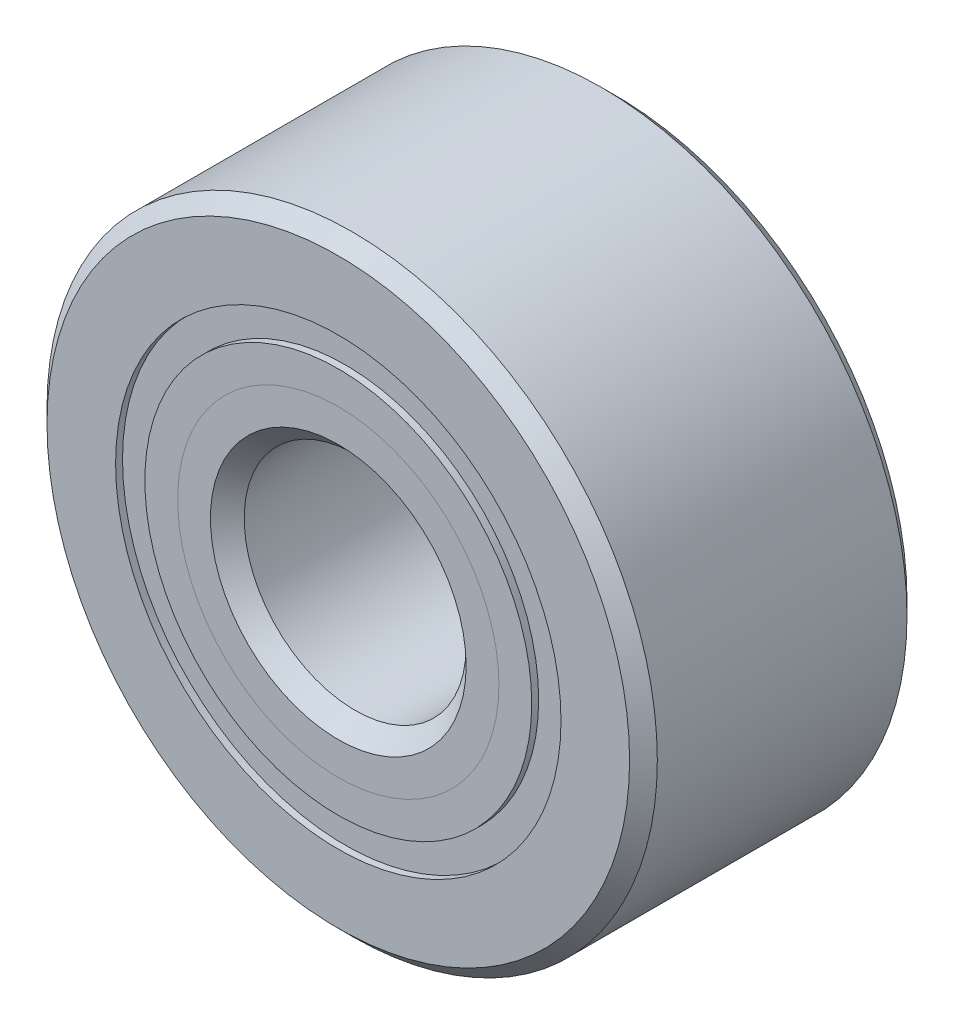
ISO-10303-21;
HEADER;
FILE_DESCRIPTION(('STEP AP214'),'2;1');
FILE_NAME('part.step','',(''),(''),'','','');
FILE_SCHEMA(('AUTOMOTIVE_DESIGN { 1 0 10303 214 1 1 1 1 }'));
ENDSEC;
DATA;
#1=APPLICATION_CONTEXT('core data for automotive mechanical design processes');
#2=APPLICATION_PROTOCOL_DEFINITION('international standard','automotive_design',2000,#1);
#3=PRODUCT_CONTEXT('',#1,'mechanical');
#4=PRODUCT('Part','Part','',(#3));
#5=PRODUCT_RELATED_PRODUCT_CATEGORY('part','',(#4));
#6=PRODUCT_DEFINITION_FORMATION('','',#4);
#7=PRODUCT_DEFINITION_CONTEXT('part definition',#1,'design');
#8=PRODUCT_DEFINITION('design','',#6,#7);
#9=PRODUCT_DEFINITION_SHAPE('','',#8);
#10=(LENGTH_UNIT() NAMED_UNIT(*) SI_UNIT(.MILLI.,.METRE.));
#11=(NAMED_UNIT(*) PLANE_ANGLE_UNIT() SI_UNIT($,.RADIAN.));
#12=(NAMED_UNIT(*) SI_UNIT($,.STERADIAN.) SOLID_ANGLE_UNIT());
#13=UNCERTAINTY_MEASURE_WITH_UNIT(LENGTH_MEASURE(1.E-05),#10,'distance_accuracy_value','');
#14=(GEOMETRIC_REPRESENTATION_CONTEXT(3) GLOBAL_UNCERTAINTY_ASSIGNED_CONTEXT((#13)) GLOBAL_UNIT_ASSIGNED_CONTEXT((#10,
#11,#12)) REPRESENTATION_CONTEXT('',''));
#15=CARTESIAN_POINT('',(0.,0.,0.));
#16=DIRECTION('',(0.,0.,1.));
#17=DIRECTION('',(1.,0.,0.));
#18=AXIS2_PLACEMENT_3D('',#15,#16,#17);
#19=CARTESIAN_POINT('',(0.,6.37180631868132,-3.7703125));
#20=DIRECTION('',(0.,0.,1.));
#21=DIRECTION('',(1.,0.,0.));
#22=AXIS2_PLACEMENT_3D('',#19,#20,#21);
#23=PLANE('',#22);
#24=CARTESIAN_POINT('',(0.,0.,-3.7703125));
#25=DIRECTION('',(0.,0.,1.));
#26=DIRECTION('',(1.,0.,0.));
#27=AXIS2_PLACEMENT_3D('',#24,#25,#26);
#28=CIRCLE('',#27,6.37180631868132);
#29=CARTESIAN_POINT('',(6.37180631868132,0.,-3.7703125));
#30=VERTEX_POINT('',#29);
#31=EDGE_CURVE('E56',#30,#30,#28,.T.);
#32=ORIENTED_EDGE('',*,*,#31,.F.);
#33=EDGE_LOOP('',(#32));
#34=FACE_BOUND('',#33,.T.);
#35=CARTESIAN_POINT('',(0.,0.,-3.7703125));
#36=DIRECTION('',(0.,0.,1.));
#37=DIRECTION('',(1.,0.,0.));
#38=AXIS2_PLACEMENT_3D('',#35,#36,#37);
#39=CIRCLE('',#38,5.53444368131868);
#40=CARTESIAN_POINT('',(5.53444368131868,0.,-3.7703125));
#41=VERTEX_POINT('',#40);
#42=EDGE_CURVE('E11',#41,#41,#39,.T.);
#43=ORIENTED_EDGE('',*,*,#42,.T.);
#44=EDGE_LOOP('',(#43));
#45=FACE_BOUND('',#44,.T.);
#46=ADVANCED_FACE('F42',(#34,#45),#23,.F.);
#47=CARTESIAN_POINT('',(0.,0.,3.96875));
#48=DIRECTION('',(0.,0.,1.));
#49=DIRECTION('',(1.,0.,0.));
#50=AXIS2_PLACEMENT_3D('',#47,#48,#49);
#51=CYLINDRICAL_SURFACE('',#50,5.53444368131868);
#52=ORIENTED_EDGE('',*,*,#42,.F.);
#53=EDGE_LOOP('',(#52));
#54=FACE_BOUND('',#53,.T.);
#55=CARTESIAN_POINT('',(0.,0.,-1.81289769677122));
#56=DIRECTION('',(0.,0.,1.));
#57=DIRECTION('',(1.,0.,0.));
#58=AXIS2_PLACEMENT_3D('',#55,#56,#57);
#59=CIRCLE('',#58,5.53444368131868);
#60=CARTESIAN_POINT('',(5.53444368131868,0.,-1.81289769677122));
#61=VERTEX_POINT('',#60);
#62=EDGE_CURVE('E48',#61,#61,#59,.T.);
#63=ORIENTED_EDGE('',*,*,#62,.T.);
#64=EDGE_LOOP('',(#63));
#65=FACE_BOUND('',#64,.T.);
#66=ADVANCED_FACE('F65',(#54,#65),#51,.F.);
#67=CARTESIAN_POINT('',(0.,6.37180631868131,-1.81289769677122));
#68=DIRECTION('',(0.,0.,-1.));
#69=DIRECTION('',(-1.,0.,0.));
#70=AXIS2_PLACEMENT_3D('',#67,#68,#69);
#71=PLANE('',#70);
#72=ORIENTED_EDGE('',*,*,#62,.F.);
#73=EDGE_LOOP('',(#72));
#74=FACE_BOUND('',#73,.T.);
#75=CARTESIAN_POINT('',(0.,0.,-1.81289769677122));
#76=DIRECTION('',(0.,0.,1.));
#77=DIRECTION('',(1.,0.,0.));
#78=AXIS2_PLACEMENT_3D('',#75,#76,#77);
#79=CIRCLE('',#78,6.37180631868131);
#80=CARTESIAN_POINT('',(6.37180631868131,0.,-1.81289769677122));
#81=VERTEX_POINT('',#80);
#82=EDGE_CURVE('E52',#81,#81,#79,.T.);
#83=ORIENTED_EDGE('',*,*,#82,.T.);
#84=EDGE_LOOP('',(#83));
#85=FACE_BOUND('',#84,.T.);
#86=ADVANCED_FACE('F69',(#74,#85),#71,.F.);
#87=CARTESIAN_POINT('',(0.,0.,3.96875));
#88=DIRECTION('',(0.,0.,1.));
#89=DIRECTION('',(1.,0.,0.));
#90=AXIS2_PLACEMENT_3D('',#87,#88,#89);
#91=CYLINDRICAL_SURFACE('',#90,6.37180631868132);
#92=ORIENTED_EDGE('',*,*,#82,.F.);
#93=EDGE_LOOP('',(#92));
#94=FACE_BOUND('',#93,.T.);
#95=ORIENTED_EDGE('',*,*,#31,.T.);
#96=EDGE_LOOP('',(#95));
#97=FACE_BOUND('',#96,.T.);
#98=ADVANCED_FACE('F62',(#94,#97),#91,.T.);
#99=CLOSED_SHELL('',(#46,#66,#86,#98));
#100=MANIFOLD_SOLID_BREP('B2',#99);
#101=CARTESIAN_POINT('',(0.,6.37180631868131,3.7703125));
#102=DIRECTION('',(0.,0.,-1.));
#103=DIRECTION('',(-1.,0.,0.));
#104=AXIS2_PLACEMENT_3D('',#101,#102,#103);
#105=PLANE('',#104);
#106=CARTESIAN_POINT('',(0.,0.,3.7703125));
#107=DIRECTION('',(0.,0.,1.));
#108=DIRECTION('',(1.,0.,0.));
#109=AXIS2_PLACEMENT_3D('',#106,#107,#108);
#110=CIRCLE('',#109,5.53444368131868);
#111=CARTESIAN_POINT('',(5.53444368131868,0.,3.7703125));
#112=VERTEX_POINT('',#111);
#113=EDGE_CURVE('E41',#112,#112,#110,.T.);
#114=ORIENTED_EDGE('',*,*,#113,.F.);
#115=EDGE_LOOP('',(#114));
#116=FACE_BOUND('',#115,.T.);
#117=CARTESIAN_POINT('',(0.,0.,3.7703125));
#118=DIRECTION('',(0.,0.,1.));
#119=DIRECTION('',(1.,0.,0.));
#120=AXIS2_PLACEMENT_3D('',#117,#118,#119);
#121=CIRCLE('',#120,6.37180631868131);
#122=CARTESIAN_POINT('',(6.37180631868131,0.,3.7703125));
#123=VERTEX_POINT('',#122);
#124=EDGE_CURVE('E124',#123,#123,#121,.T.);
#125=ORIENTED_EDGE('',*,*,#124,.T.);
#126=EDGE_LOOP('',(#125));
#127=FACE_BOUND('',#126,.T.);
#128=ADVANCED_FACE('F110',(#116,#127),#105,.F.);
#129=CARTESIAN_POINT('',(0.,0.,3.96875));
#130=DIRECTION('',(0.,0.,1.));
#131=DIRECTION('',(1.,0.,0.));
#132=AXIS2_PLACEMENT_3D('',#129,#130,#131);
#133=CYLINDRICAL_SURFACE('',#132,5.53444368131868);
#134=CARTESIAN_POINT('',(0.,0.,1.81289769677122));
#135=DIRECTION('',(0.,0.,1.));
#136=DIRECTION('',(1.,0.,0.));
#137=AXIS2_PLACEMENT_3D('',#134,#135,#136);
#138=CIRCLE('',#137,5.53444368131868);
#139=CARTESIAN_POINT('',(5.53444368131868,0.,1.81289769677122));
#140=VERTEX_POINT('',#139);
#141=EDGE_CURVE('E116',#140,#140,#138,.T.);
#142=ORIENTED_EDGE('',*,*,#141,.F.);
#143=EDGE_LOOP('',(#142));
#144=FACE_BOUND('',#143,.T.);
#145=ORIENTED_EDGE('',*,*,#113,.T.);
#146=EDGE_LOOP('',(#145));
#147=FACE_BOUND('',#146,.T.);
#148=ADVANCED_FACE('F139',(#144,#147),#133,.F.);
#149=CARTESIAN_POINT('',(0.,6.37180631868131,1.81289769677122));
#150=DIRECTION('',(0.,0.,1.));
#151=DIRECTION('',(1.,0.,0.));
#152=AXIS2_PLACEMENT_3D('',#149,#150,#151);
#153=PLANE('',#152);
#154=CARTESIAN_POINT('',(0.,0.,1.81289769677122));
#155=DIRECTION('',(0.,0.,1.));
#156=DIRECTION('',(1.,0.,0.));
#157=AXIS2_PLACEMENT_3D('',#154,#155,#156);
#158=CIRCLE('',#157,6.37180631868131);
#159=CARTESIAN_POINT('',(6.37180631868131,0.,1.81289769677122));
#160=VERTEX_POINT('',#159);
#161=EDGE_CURVE('E120',#160,#160,#158,.T.);
#162=ORIENTED_EDGE('',*,*,#161,.F.);
#163=EDGE_LOOP('',(#162));
#164=FACE_BOUND('',#163,.T.);
#165=ORIENTED_EDGE('',*,*,#141,.T.);
#166=EDGE_LOOP('',(#165));
#167=FACE_BOUND('',#166,.T.);
#168=ADVANCED_FACE('F134',(#164,#167),#153,.F.);
#169=CARTESIAN_POINT('',(0.,0.,3.96875));
#170=DIRECTION('',(0.,0.,1.));
#171=DIRECTION('',(1.,0.,0.));
#172=AXIS2_PLACEMENT_3D('',#169,#170,#171);
#173=CYLINDRICAL_SURFACE('',#172,6.37180631868131);
#174=ORIENTED_EDGE('',*,*,#124,.F.);
#175=EDGE_LOOP('',(#174));
#176=FACE_BOUND('',#175,.T.);
#177=ORIENTED_EDGE('',*,*,#161,.T.);
#178=EDGE_LOOP('',(#177));
#179=FACE_BOUND('',#178,.T.);
#180=ADVANCED_FACE('F131',(#176,#179),#173,.T.);
#181=CLOSED_SHELL('',(#128,#148,#168,#180));
#182=MANIFOLD_SOLID_BREP('B6',#181);
#183=CARTESIAN_POINT('',(-4.20949505675111,4.20949505675122,0.));
#184=DIRECTION('',(0.,0.,1.));
#185=DIRECTION('',(-0.707106781186539,0.707106781186556,0.));
#186=AXIS2_PLACEMENT_3D('',#183,#184,#185);
#187=SPHERICAL_SURFACE('',#186,1.81289769677122);
#188=CARTESIAN_POINT('',(-4.20949505675111,4.20949505675122,1.81289769677122));
#189=VERTEX_POINT('',#188);
#190=VERTEX_LOOP('',#189);
#191=FACE_BOUND('',#190,.T.);
#192=ADVANCED_FACE('F179',(#191),#187,.T.);
#193=CLOSED_SHELL('',(#192));
#194=MANIFOLD_SOLID_BREP('B36',#193);
#195=CARTESIAN_POINT('',(-5.953125,0.,0.));
#196=DIRECTION('',(0.,0.,1.));
#197=DIRECTION('',(-1.,0.,0.));
#198=AXIS2_PLACEMENT_3D('',#195,#196,#197);
#199=SPHERICAL_SURFACE('',#198,1.81289769677122);
#200=CARTESIAN_POINT('',(-5.953125,0.,1.81289769677122));
#201=VERTEX_POINT('',#200);
#202=VERTEX_LOOP('',#201);
#203=FACE_BOUND('',#202,.T.);
#204=ADVANCED_FACE('F200',(#203),#199,.T.);
#205=CLOSED_SHELL('',(#204));
#206=MANIFOLD_SOLID_BREP('B106',#205);
#207=CARTESIAN_POINT('',(-4.2094950567512,-4.20949505675113,0.));
#208=DIRECTION('',(0.,0.,1.));
#209=DIRECTION('',(-0.707106781186554,-0.707106781186541,0.));
#210=AXIS2_PLACEMENT_3D('',#207,#208,#209);
#211=SPHERICAL_SURFACE('',#210,1.81289769677122);
#212=CARTESIAN_POINT('',(-4.2094950567512,-4.20949505675113,1.81289769677122));
#213=VERTEX_POINT('',#212);
#214=VERTEX_LOOP('',#213);
#215=FACE_BOUND('',#214,.T.);
#216=ADVANCED_FACE('F221',(#215),#211,.T.);
#217=CLOSED_SHELL('',(#216));
#218=MANIFOLD_SOLID_BREP('B175',#217);
#219=CARTESIAN_POINT('',(0.,-5.953125,0.));
#220=DIRECTION('',(0.,0.,1.));
#221=DIRECTION('',(0.,-1.,0.));
#222=AXIS2_PLACEMENT_3D('',#219,#220,#221);
#223=SPHERICAL_SURFACE('',#222,1.81289769677122);
#224=CARTESIAN_POINT('',(0.,-5.953125,1.81289769677122));
#225=VERTEX_POINT('',#224);
#226=VERTEX_LOOP('',#225);
#227=FACE_BOUND('',#226,.T.);
#228=ADVANCED_FACE('F242',(#227),#223,.T.);
#229=CLOSED_SHELL('',(#228));
#230=MANIFOLD_SOLID_BREP('B196',#229);
#231=CARTESIAN_POINT('',(4.20949505675114,-4.20949505675119,0.));
#232=DIRECTION('',(0.,0.,1.));
#233=DIRECTION('',(0.707106781186544,-0.707106781186551,0.));
#234=AXIS2_PLACEMENT_3D('',#231,#232,#233);
#235=SPHERICAL_SURFACE('',#234,1.81289769677122);
#236=CARTESIAN_POINT('',(4.20949505675114,-4.20949505675119,1.81289769677122));
#237=VERTEX_POINT('',#236);
#238=VERTEX_LOOP('',#237);
#239=FACE_BOUND('',#238,.T.);
#240=ADVANCED_FACE('F263',(#239),#235,.T.);
#241=CLOSED_SHELL('',(#240));
#242=MANIFOLD_SOLID_BREP('B217',#241);
#243=CARTESIAN_POINT('',(5.953125,0.,0.));
#244=DIRECTION('',(0.,0.,1.));
#245=DIRECTION('',(1.,0.,0.));
#246=AXIS2_PLACEMENT_3D('',#243,#244,#245);
#247=SPHERICAL_SURFACE('',#246,1.81289769677122);
#248=CARTESIAN_POINT('',(5.953125,0.,1.81289769677122));
#249=VERTEX_POINT('',#248);
#250=VERTEX_LOOP('',#249);
#251=FACE_BOUND('',#250,.T.);
#252=ADVANCED_FACE('F284',(#251),#247,.T.);
#253=CLOSED_SHELL('',(#252));
#254=MANIFOLD_SOLID_BREP('B238',#253);
#255=CARTESIAN_POINT('',(4.20949505675117,4.20949505675116,0.));
#256=DIRECTION('',(0.,0.,1.));
#257=DIRECTION('',(0.707106781186549,0.707106781186546,0.));
#258=AXIS2_PLACEMENT_3D('',#255,#256,#257);
#259=SPHERICAL_SURFACE('',#258,1.81289769677122);
#260=CARTESIAN_POINT('',(4.20949505675117,4.20949505675116,1.81289769677122));
#261=VERTEX_POINT('',#260);
#262=VERTEX_LOOP('',#261);
#263=FACE_BOUND('',#262,.T.);
#264=ADVANCED_FACE('F305',(#263),#259,.T.);
#265=CLOSED_SHELL('',(#264));
#266=MANIFOLD_SOLID_BREP('B259',#265);
#267=CARTESIAN_POINT('',(0.,5.953125,0.));
#268=DIRECTION('',(0.,0.,1.));
#269=DIRECTION('',(0.,1.,0.));
#270=AXIS2_PLACEMENT_3D('',#267,#268,#269);
#271=SPHERICAL_SURFACE('',#270,1.81289769677122);
#272=CARTESIAN_POINT('',(0.,5.953125,1.81289769677122));
#273=VERTEX_POINT('',#272);
#274=VERTEX_LOOP('',#273);
#275=FACE_BOUND('',#274,.T.);
#276=ADVANCED_FACE('F327',(#275),#271,.T.);
#277=CLOSED_SHELL('',(#276));
#278=MANIFOLD_SOLID_BREP('B280',#277);
#279=CARTESIAN_POINT('',(0.,4.59602866646653,3.96875));
#280=DIRECTION('',(0.,0.,-1.));
#281=DIRECTION('',(-1.,0.,0.));
#282=AXIS2_PLACEMENT_3D('',#279,#280,#281);
#283=PLANE('',#282);
#284=CARTESIAN_POINT('',(0.,0.,3.96875));
#285=DIRECTION('',(0.,0.,1.));
#286=DIRECTION('',(1.,0.,0.));
#287=AXIS2_PLACEMENT_3D('',#284,#285,#286);
#288=CIRCLE('',#287,3.65761365161439);
#289=CARTESIAN_POINT('',(3.65761365161439,0.,3.96875));
#290=VERTEX_POINT('',#289);
#291=EDGE_CURVE('E382',#290,#290,#288,.T.);
#292=ORIENTED_EDGE('',*,*,#291,.F.);
#293=EDGE_LOOP('',(#292));
#294=FACE_BOUND('',#293,.T.);
#295=CARTESIAN_POINT('',(0.,0.,3.96875));
#296=DIRECTION('',(0.,0.,1.));
#297=DIRECTION('',(1.,0.,0.));
#298=AXIS2_PLACEMENT_3D('',#295,#296,#297);
#299=CIRCLE('',#298,4.59602866646653);
#300=CARTESIAN_POINT('',(4.59602866646653,0.,3.96875));
#301=VERTEX_POINT('',#300);
#302=EDGE_CURVE('E326',#301,#301,#299,.T.);
#303=ORIENTED_EDGE('',*,*,#302,.T.);
#304=EDGE_LOOP('',(#303));
#305=FACE_BOUND('',#304,.T.);
#306=ADVANCED_FACE('F348',(#294,#305),#283,.F.);
#307=CARTESIAN_POINT('',(0.,0.,3.03033498514786));
#308=DIRECTION('',(0.,0.,1.));
#309=DIRECTION('',(1.,0.,0.));
#310=AXIS2_PLACEMENT_3D('',#307,#308,#309);
#311=CONICAL_SURFACE('',#310,3.65761365161439,0.785398163397451);
#312=ORIENTED_EDGE('',*,*,#302,.F.);
#313=EDGE_LOOP('',(#312));
#314=FACE_BOUND('',#313,.T.);
#315=CARTESIAN_POINT('',(0.,0.,3.03033498514786));
#316=DIRECTION('',(0.,0.,1.));
#317=DIRECTION('',(1.,0.,0.));
#318=AXIS2_PLACEMENT_3D('',#315,#316,#317);
#319=CIRCLE('',#318,3.65761365161439);
#320=CARTESIAN_POINT('',(3.65761365161439,0.,3.03033498514786));
#321=VERTEX_POINT('',#320);
#322=EDGE_CURVE('E354',#321,#321,#319,.T.);
#323=ORIENTED_EDGE('',*,*,#322,.T.);
#324=EDGE_LOOP('',(#323));
#325=FACE_BOUND('',#324,.T.);
#326=ADVANCED_FACE('F389',(#314,#325),#311,.T.);
#327=CARTESIAN_POINT('',(0.,0.,3.96875));
#328=DIRECTION('',(0.,0.,1.));
#329=DIRECTION('',(1.,0.,0.));
#330=AXIS2_PLACEMENT_3D('',#327,#328,#329);
#331=CYLINDRICAL_SURFACE('',#330,3.65761365161439);
#332=ORIENTED_EDGE('',*,*,#322,.F.);
#333=EDGE_LOOP('',(#332));
#334=FACE_BOUND('',#333,.T.);
#335=CARTESIAN_POINT('',(0.,0.,0.));
#336=DIRECTION('',(0.,0.,1.));
#337=DIRECTION('',(1.,0.,0.));
#338=AXIS2_PLACEMENT_3D('',#335,#336,#337);
#339=CIRCLE('',#338,3.65761365161439);
#340=CARTESIAN_POINT('',(3.65761365161439,0.,0.));
#341=VERTEX_POINT('',#340);
#342=EDGE_CURVE('E358',#341,#341,#339,.T.);
#343=ORIENTED_EDGE('',*,*,#342,.T.);
#344=EDGE_LOOP('',(#343));
#345=FACE_BOUND('',#344,.T.);
#346=ADVANCED_FACE('F393',(#334,#345),#331,.T.);
#347=CARTESIAN_POINT('',(0.,3.65761365161439,0.));
#348=DIRECTION('',(0.,0.,-1.));
#349=DIRECTION('',(-1.,0.,0.));
#350=AXIS2_PLACEMENT_3D('',#347,#348,#349);
#351=PLANE('',#350);
#352=ORIENTED_EDGE('',*,*,#342,.F.);
#353=EDGE_LOOP('',(#352));
#354=FACE_BOUND('',#353,.T.);
#355=CARTESIAN_POINT('',(0.,0.,0.));
#356=DIRECTION('',(0.,0.,1.));
#357=DIRECTION('',(1.,0.,0.));
#358=AXIS2_PLACEMENT_3D('',#355,#356,#357);
#359=CIRCLE('',#358,4.14022730322877);
#360=CARTESIAN_POINT('',(4.14022730322877,0.,0.));
#361=VERTEX_POINT('',#360);
#362=EDGE_CURVE('E362',#361,#361,#359,.T.);
#363=ORIENTED_EDGE('',*,*,#362,.T.);
#364=EDGE_LOOP('',(#363));
#365=FACE_BOUND('',#364,.T.);
#366=ADVANCED_FACE('F398',(#354,#365),#351,.F.);
#367=CARTESIAN_POINT('',(0.,0.,0.));
#368=DIRECTION('',(0.,0.,1.));
#369=DIRECTION('',(1.,0.,0.));
#370=AXIS2_PLACEMENT_3D('',#367,#368,#369);
#371=TOROIDAL_SURFACE('',#370,5.953125,1.81289769677122);
#372=ORIENTED_EDGE('',*,*,#362,.F.);
#373=EDGE_LOOP('',(#372));
#374=FACE_BOUND('',#373,.T.);
#375=CARTESIAN_POINT('',(0.,0.,-1.76388888888889));
#376=DIRECTION('',(0.,0.,1.));
#377=DIRECTION('',(1.,0.,0.));
#378=AXIS2_PLACEMENT_3D('',#375,#376,#377);
#379=CIRCLE('',#378,5.53444368131868);
#380=CARTESIAN_POINT('',(5.53444368131868,0.,-1.76388888888889));
#381=VERTEX_POINT('',#380);
#382=EDGE_CURVE('E367',#381,#381,#379,.T.);
#383=ORIENTED_EDGE('',*,*,#382,.T.);
#384=EDGE_LOOP('',(#383));
#385=FACE_BOUND('',#384,.T.);
#386=ADVANCED_FACE('F404',(#374,#385),#371,.F.);
#387=CARTESIAN_POINT('',(0.,0.,3.96875));
#388=DIRECTION('',(0.,0.,1.));
#389=DIRECTION('',(1.,0.,0.));
#390=AXIS2_PLACEMENT_3D('',#387,#388,#389);
#391=CYLINDRICAL_SURFACE('',#390,5.53444368131868);
#392=ORIENTED_EDGE('',*,*,#382,.F.);
#393=EDGE_LOOP('',(#392));
#394=FACE_BOUND('',#393,.T.);
#395=CARTESIAN_POINT('',(0.,0.,-3.96875));
#396=DIRECTION('',(0.,0.,1.));
#397=DIRECTION('',(1.,0.,0.));
#398=AXIS2_PLACEMENT_3D('',#395,#396,#397);
#399=CIRCLE('',#398,5.53444368131868);
#400=CARTESIAN_POINT('',(5.53444368131868,0.,-3.96875));
#401=VERTEX_POINT('',#400);
#402=EDGE_CURVE('E370',#401,#401,#399,.T.);
#403=ORIENTED_EDGE('',*,*,#402,.T.);
#404=EDGE_LOOP('',(#403));
#405=FACE_BOUND('',#404,.T.);
#406=ADVANCED_FACE('F408',(#394,#405),#391,.T.);
#407=CARTESIAN_POINT('',(0.,3.571875,-3.96875));
#408=DIRECTION('',(0.,0.,1.));
#409=DIRECTION('',(1.,0.,0.));
#410=AXIS2_PLACEMENT_3D('',#407,#408,#409);
#411=PLANE('',#410);
#412=ORIENTED_EDGE('',*,*,#402,.F.);
#413=EDGE_LOOP('',(#412));
#414=FACE_BOUND('',#413,.T.);
#415=CARTESIAN_POINT('',(0.,0.,-3.96875));
#416=DIRECTION('',(0.,0.,1.));
#417=DIRECTION('',(1.,0.,0.));
#418=AXIS2_PLACEMENT_3D('',#415,#416,#417);
#419=CIRCLE('',#418,3.571875);
#420=CARTESIAN_POINT('',(3.571875,0.,-3.96875));
#421=VERTEX_POINT('',#420);
#422=EDGE_CURVE('E373',#421,#421,#419,.T.);
#423=ORIENTED_EDGE('',*,*,#422,.T.);
#424=EDGE_LOOP('',(#423));
#425=FACE_BOUND('',#424,.T.);
#426=ADVANCED_FACE('F412',(#414,#425),#411,.F.);
#427=CARTESIAN_POINT('',(0.,0.,-3.571875));
#428=DIRECTION('',(0.,0.,-1.));
#429=DIRECTION('',(-1.,0.,0.));
#430=AXIS2_PLACEMENT_3D('',#427,#428,#429);
#431=CONICAL_SURFACE('',#430,3.175,0.785398163397447);
#432=ORIENTED_EDGE('',*,*,#422,.F.);
#433=EDGE_LOOP('',(#432));
#434=FACE_BOUND('',#433,.T.);
#435=CARTESIAN_POINT('',(0.,0.,-3.571875));
#436=DIRECTION('',(0.,0.,1.));
#437=DIRECTION('',(1.,0.,0.));
#438=AXIS2_PLACEMENT_3D('',#435,#436,#437);
#439=CIRCLE('',#438,3.175);
#440=CARTESIAN_POINT('',(3.175,0.,-3.571875));
#441=VERTEX_POINT('',#440);
#442=EDGE_CURVE('E376',#441,#441,#439,.T.);
#443=ORIENTED_EDGE('',*,*,#442,.T.);
#444=EDGE_LOOP('',(#443));
#445=FACE_BOUND('',#444,.T.);
#446=ADVANCED_FACE('F416',(#434,#445),#431,.F.);
#447=CARTESIAN_POINT('',(0.,0.,3.96875));
#448=DIRECTION('',(0.,0.,1.));
#449=DIRECTION('',(1.,0.,0.));
#450=AXIS2_PLACEMENT_3D('',#447,#448,#449);
#451=CYLINDRICAL_SURFACE('',#450,3.175);
#452=ORIENTED_EDGE('',*,*,#442,.F.);
#453=EDGE_LOOP('',(#452));
#454=FACE_BOUND('',#453,.T.);
#455=CARTESIAN_POINT('',(0.,0.,3.48613634838561));
#456=DIRECTION('',(0.,0.,1.));
#457=DIRECTION('',(1.,0.,0.));
#458=AXIS2_PLACEMENT_3D('',#455,#456,#457);
#459=CIRCLE('',#458,3.175);
#460=CARTESIAN_POINT('',(3.175,0.,3.48613634838561));
#461=VERTEX_POINT('',#460);
#462=EDGE_CURVE('E379',#461,#461,#459,.T.);
#463=ORIENTED_EDGE('',*,*,#462,.T.);
#464=EDGE_LOOP('',(#463));
#465=FACE_BOUND('',#464,.T.);
#466=ADVANCED_FACE('F420',(#454,#465),#451,.F.);
#467=CARTESIAN_POINT('',(0.,0.,3.96875));
#468=DIRECTION('',(0.,0.,1.));
#469=DIRECTION('',(1.,0.,0.));
#470=AXIS2_PLACEMENT_3D('',#467,#468,#469);
#471=CONICAL_SURFACE('',#470,3.65761365161439,0.785398163397451);
#472=ORIENTED_EDGE('',*,*,#462,.F.);
#473=EDGE_LOOP('',(#472));
#474=FACE_BOUND('',#473,.T.);
#475=ORIENTED_EDGE('',*,*,#291,.T.);
#476=EDGE_LOOP('',(#475));
#477=FACE_BOUND('',#476,.T.);
#478=ADVANCED_FACE('F386',(#474,#477),#471,.F.);
#479=CLOSED_SHELL('',(#306,#326,#346,#366,#386,#406,#426,#446,#466,#478));
#480=MANIFOLD_SOLID_BREP('B301',#479);
#481=CARTESIAN_POINT('',(0.,5.53444368131868,3.96875));
#482=DIRECTION('',(0.,0.,-1.));
#483=DIRECTION('',(-1.,0.,0.));
#484=AXIS2_PLACEMENT_3D('',#481,#482,#483);
#485=PLANE('',#484);
#486=CARTESIAN_POINT('',(0.,0.,3.96875));
#487=DIRECTION('',(0.,0.,1.));
#488=DIRECTION('',(1.,0.,0.));
#489=AXIS2_PLACEMENT_3D('',#486,#487,#488);
#490=CIRCLE('',#489,4.59602866646653);
#491=CARTESIAN_POINT('',(4.59602866646653,0.,3.96875));
#492=VERTEX_POINT('',#491);
#493=EDGE_CURVE('E347',#492,#492,#490,.T.);
#494=ORIENTED_EDGE('',*,*,#493,.F.);
#495=EDGE_LOOP('',(#494));
#496=FACE_BOUND('',#495,.T.);
#497=CARTESIAN_POINT('',(0.,0.,3.96875));
#498=DIRECTION('',(0.,0.,1.));
#499=DIRECTION('',(1.,0.,0.));
#500=AXIS2_PLACEMENT_3D('',#497,#498,#499);
#501=CIRCLE('',#500,5.53444368131868);
#502=CARTESIAN_POINT('',(5.53444368131868,0.,3.96875));
#503=VERTEX_POINT('',#502);
#504=EDGE_CURVE('E529',#503,#503,#501,.T.);
#505=ORIENTED_EDGE('',*,*,#504,.T.);
#506=EDGE_LOOP('',(#505));
#507=FACE_BOUND('',#506,.T.);
#508=ADVANCED_FACE('F507',(#496,#507),#485,.F.);
#509=CARTESIAN_POINT('',(0.,0.,3.96875));
#510=DIRECTION('',(0.,0.,1.));
#511=DIRECTION('',(1.,0.,0.));
#512=AXIS2_PLACEMENT_3D('',#509,#510,#511);
#513=CONICAL_SURFACE('',#512,4.59602866646653,0.785398163397451);
#514=CARTESIAN_POINT('',(0.,0.,3.03033498514786));
#515=DIRECTION('',(0.,0.,1.));
#516=DIRECTION('',(1.,0.,0.));
#517=AXIS2_PLACEMENT_3D('',#514,#515,#516);
#518=CIRCLE('',#517,3.65761365161439);
#519=CARTESIAN_POINT('',(3.65761365161439,0.,3.03033498514786));
#520=VERTEX_POINT('',#519);
#521=EDGE_CURVE('E513',#520,#520,#518,.T.);
#522=ORIENTED_EDGE('',*,*,#521,.F.);
#523=EDGE_LOOP('',(#522));
#524=FACE_BOUND('',#523,.T.);
#525=ORIENTED_EDGE('',*,*,#493,.T.);
#526=EDGE_LOOP('',(#525));
#527=FACE_BOUND('',#526,.T.);
#528=ADVANCED_FACE('F554',(#524,#527),#513,.F.);
#529=CARTESIAN_POINT('',(0.,0.,3.96875));
#530=DIRECTION('',(0.,0.,1.));
#531=DIRECTION('',(1.,0.,0.));
#532=AXIS2_PLACEMENT_3D('',#529,#530,#531);
#533=CYLINDRICAL_SURFACE('',#532,3.65761365161439);
#534=CARTESIAN_POINT('',(0.,0.,0.));
#535=DIRECTION('',(0.,0.,1.));
#536=DIRECTION('',(1.,0.,0.));
#537=AXIS2_PLACEMENT_3D('',#534,#535,#536);
#538=CIRCLE('',#537,3.65761365161439);
#539=CARTESIAN_POINT('',(3.65761365161439,0.,0.));
#540=VERTEX_POINT('',#539);
#541=EDGE_CURVE('E517',#540,#540,#538,.T.);
#542=ORIENTED_EDGE('',*,*,#541,.F.);
#543=EDGE_LOOP('',(#542));
#544=FACE_BOUND('',#543,.T.);
#545=ORIENTED_EDGE('',*,*,#521,.T.);
#546=EDGE_LOOP('',(#545));
#547=FACE_BOUND('',#546,.T.);
#548=ADVANCED_FACE('F549',(#544,#547),#533,.F.);
#549=CARTESIAN_POINT('',(0.,3.65761365161439,0.));
#550=DIRECTION('',(0.,0.,1.));
#551=DIRECTION('',(1.,0.,0.));
#552=AXIS2_PLACEMENT_3D('',#549,#550,#551);
#553=PLANE('',#552);
#554=CARTESIAN_POINT('',(0.,0.,0.));
#555=DIRECTION('',(0.,0.,1.));
#556=DIRECTION('',(1.,0.,0.));
#557=AXIS2_PLACEMENT_3D('',#554,#555,#556);
#558=CIRCLE('',#557,4.14022730322877);
#559=CARTESIAN_POINT('',(4.14022730322877,0.,0.));
#560=VERTEX_POINT('',#559);
#561=EDGE_CURVE('E521',#560,#560,#558,.T.);
#562=ORIENTED_EDGE('',*,*,#561,.F.);
#563=EDGE_LOOP('',(#562));
#564=FACE_BOUND('',#563,.T.);
#565=ORIENTED_EDGE('',*,*,#541,.T.);
#566=EDGE_LOOP('',(#565));
#567=FACE_BOUND('',#566,.T.);
#568=ADVANCED_FACE('F543',(#564,#567),#553,.F.);
#569=CARTESIAN_POINT('',(0.,0.,0.));
#570=DIRECTION('',(0.,0.,1.));
#571=DIRECTION('',(1.,0.,0.));
#572=AXIS2_PLACEMENT_3D('',#569,#570,#571);
#573=TOROIDAL_SURFACE('',#572,5.953125,1.81289769677122);
#574=CARTESIAN_POINT('',(0.,0.,1.76388888888889));
#575=DIRECTION('',(0.,0.,1.));
#576=DIRECTION('',(1.,0.,0.));
#577=AXIS2_PLACEMENT_3D('',#574,#575,#576);
#578=CIRCLE('',#577,5.53444368131868);
#579=CARTESIAN_POINT('',(5.53444368131868,0.,1.76388888888889));
#580=VERTEX_POINT('',#579);
#581=EDGE_CURVE('E526',#580,#580,#578,.T.);
#582=ORIENTED_EDGE('',*,*,#581,.F.);
#583=EDGE_LOOP('',(#582));
#584=FACE_BOUND('',#583,.T.);
#585=ORIENTED_EDGE('',*,*,#561,.T.);
#586=EDGE_LOOP('',(#585));
#587=FACE_BOUND('',#586,.T.);
#588=ADVANCED_FACE('F537',(#584,#587),#573,.F.);
#589=CARTESIAN_POINT('',(0.,0.,3.96875));
#590=DIRECTION('',(0.,0.,1.));
#591=DIRECTION('',(1.,0.,0.));
#592=AXIS2_PLACEMENT_3D('',#589,#590,#591);
#593=CYLINDRICAL_SURFACE('',#592,5.53444368131868);
#594=ORIENTED_EDGE('',*,*,#504,.F.);
#595=EDGE_LOOP('',(#594));
#596=FACE_BOUND('',#595,.T.);
#597=ORIENTED_EDGE('',*,*,#581,.T.);
#598=EDGE_LOOP('',(#597));
#599=FACE_BOUND('',#598,.T.);
#600=ADVANCED_FACE('F534',(#596,#599),#593,.T.);
#601=CLOSED_SHELL('',(#508,#528,#548,#568,#588,#600));
#602=MANIFOLD_SOLID_BREP('B321',#601);
#603=CARTESIAN_POINT('',(0.,0.,3.571875));
#604=DIRECTION('',(0.,0.,-1.));
#605=DIRECTION('',(-1.,0.,0.));
#606=AXIS2_PLACEMENT_3D('',#603,#604,#605);
#607=CONICAL_SURFACE('',#606,8.73125,0.785398163397449);
#608=CARTESIAN_POINT('',(0.,0.,3.96875));
#609=DIRECTION('',(0.,0.,1.));
#610=DIRECTION('',(1.,0.,0.));
#611=AXIS2_PLACEMENT_3D('',#608,#609,#610);
#612=CIRCLE('',#611,8.334375);
#613=CARTESIAN_POINT('',(8.334375,0.,3.96875));
#614=VERTEX_POINT('',#613);
#615=EDGE_CURVE('E627',#614,#614,#612,.T.);
#616=ORIENTED_EDGE('',*,*,#615,.F.);
#617=EDGE_LOOP('',(#616));
#618=FACE_BOUND('',#617,.T.);
#619=CARTESIAN_POINT('',(0.,0.,3.571875));
#620=DIRECTION('',(0.,0.,1.));
#621=DIRECTION('',(1.,0.,0.));
#622=AXIS2_PLACEMENT_3D('',#619,#620,#621);
#623=CIRCLE('',#622,8.73125);
#624=CARTESIAN_POINT('',(8.73125,0.,3.571875));
#625=VERTEX_POINT('',#624);
#626=EDGE_CURVE('E506',#625,#625,#623,.T.);
#627=ORIENTED_EDGE('',*,*,#626,.T.);
#628=EDGE_LOOP('',(#627));
#629=FACE_BOUND('',#628,.T.);
#630=ADVANCED_FACE('F599',(#618,#629),#607,.T.);
#631=CARTESIAN_POINT('',(0.,0.,3.96875));
#632=DIRECTION('',(0.,0.,1.));
#633=DIRECTION('',(1.,0.,0.));
#634=AXIS2_PLACEMENT_3D('',#631,#632,#633);
#635=CYLINDRICAL_SURFACE('',#634,8.73125);
#636=ORIENTED_EDGE('',*,*,#626,.F.);
#637=EDGE_LOOP('',(#636));
#638=FACE_BOUND('',#637,.T.);
#639=CARTESIAN_POINT('',(0.,0.,-3.571875));
#640=DIRECTION('',(0.,0.,1.));
#641=DIRECTION('',(1.,0.,0.));
#642=AXIS2_PLACEMENT_3D('',#639,#640,#641);
#643=CIRCLE('',#642,8.73125);
#644=CARTESIAN_POINT('',(8.73125,0.,-3.571875));
#645=VERTEX_POINT('',#644);
#646=EDGE_CURVE('E605',#645,#645,#643,.T.);
#647=ORIENTED_EDGE('',*,*,#646,.T.);
#648=EDGE_LOOP('',(#647));
#649=FACE_BOUND('',#648,.T.);
#650=ADVANCED_FACE('F634',(#638,#649),#635,.T.);
#651=CARTESIAN_POINT('',(0.,0.,-3.96875));
#652=DIRECTION('',(0.,0.,1.));
#653=DIRECTION('',(1.,0.,0.));
#654=AXIS2_PLACEMENT_3D('',#651,#652,#653);
#655=CONICAL_SURFACE('',#654,8.334375,0.785398163397448);
#656=ORIENTED_EDGE('',*,*,#646,.F.);
#657=EDGE_LOOP('',(#656));
#658=FACE_BOUND('',#657,.T.);
#659=CARTESIAN_POINT('',(0.,0.,-3.96875));
#660=DIRECTION('',(0.,0.,1.));
#661=DIRECTION('',(1.,0.,0.));
#662=AXIS2_PLACEMENT_3D('',#659,#660,#661);
#663=CIRCLE('',#662,8.334375);
#664=CARTESIAN_POINT('',(8.334375,0.,-3.96875));
#665=VERTEX_POINT('',#664);
#666=EDGE_CURVE('E609',#665,#665,#663,.T.);
#667=ORIENTED_EDGE('',*,*,#666,.T.);
#668=EDGE_LOOP('',(#667));
#669=FACE_BOUND('',#668,.T.);
#670=ADVANCED_FACE('F638',(#658,#669),#655,.T.);
#671=CARTESIAN_POINT('',(0.,8.334375,-3.96875));
#672=DIRECTION('',(0.,0.,1.));
#673=DIRECTION('',(1.,0.,0.));
#674=AXIS2_PLACEMENT_3D('',#671,#672,#673);
#675=PLANE('',#674);
#676=ORIENTED_EDGE('',*,*,#666,.F.);
#677=EDGE_LOOP('',(#676));
#678=FACE_BOUND('',#677,.T.);
#679=CARTESIAN_POINT('',(0.,0.,-3.96875));
#680=DIRECTION('',(0.,0.,1.));
#681=DIRECTION('',(1.,0.,0.));
#682=AXIS2_PLACEMENT_3D('',#679,#680,#681);
#683=CIRCLE('',#682,6.37180631868132);
#684=CARTESIAN_POINT('',(6.37180631868132,0.,-3.96875));
#685=VERTEX_POINT('',#684);
#686=EDGE_CURVE('E613',#685,#685,#683,.T.);
#687=ORIENTED_EDGE('',*,*,#686,.T.);
#688=EDGE_LOOP('',(#687));
#689=FACE_BOUND('',#688,.T.);
#690=ADVANCED_FACE('F643',(#678,#689),#675,.F.);
#691=CARTESIAN_POINT('',(0.,0.,3.96875));
#692=DIRECTION('',(0.,0.,1.));
#693=DIRECTION('',(1.,0.,0.));
#694=AXIS2_PLACEMENT_3D('',#691,#692,#693);
#695=CYLINDRICAL_SURFACE('',#694,6.37180631868132);
#696=ORIENTED_EDGE('',*,*,#686,.F.);
#697=EDGE_LOOP('',(#696));
#698=FACE_BOUND('',#697,.T.);
#699=CARTESIAN_POINT('',(0.,0.,-1.76388888888889));
#700=DIRECTION('',(0.,0.,1.));
#701=DIRECTION('',(1.,0.,0.));
#702=AXIS2_PLACEMENT_3D('',#699,#700,#701);
#703=CIRCLE('',#702,6.37180631868131);
#704=CARTESIAN_POINT('',(6.37180631868131,0.,-1.76388888888889));
#705=VERTEX_POINT('',#704);
#706=EDGE_CURVE('E618',#705,#705,#703,.T.);
#707=ORIENTED_EDGE('',*,*,#706,.T.);
#708=EDGE_LOOP('',(#707));
#709=FACE_BOUND('',#708,.T.);
#710=ADVANCED_FACE('F649',(#698,#709),#695,.F.);
#711=CARTESIAN_POINT('',(0.,0.,0.));
#712=DIRECTION('',(0.,0.,1.));
#713=DIRECTION('',(1.,0.,0.));
#714=AXIS2_PLACEMENT_3D('',#711,#712,#713);
#715=TOROIDAL_SURFACE('',#714,5.953125,1.81289769677122);
#716=ORIENTED_EDGE('',*,*,#706,.F.);
#717=EDGE_LOOP('',(#716));
#718=FACE_BOUND('',#717,.T.);
#719=CARTESIAN_POINT('',(0.,0.,1.76388888888889));
#720=DIRECTION('',(0.,0.,1.));
#721=DIRECTION('',(1.,0.,0.));
#722=AXIS2_PLACEMENT_3D('',#719,#720,#721);
#723=CIRCLE('',#722,6.37180631868131);
#724=CARTESIAN_POINT('',(6.37180631868131,0.,1.76388888888889));
#725=VERTEX_POINT('',#724);
#726=EDGE_CURVE('E621',#725,#725,#723,.T.);
#727=ORIENTED_EDGE('',*,*,#726,.T.);
#728=EDGE_LOOP('',(#727));
#729=FACE_BOUND('',#728,.T.);
#730=ADVANCED_FACE('F653',(#718,#729),#715,.F.);
#731=CARTESIAN_POINT('',(0.,0.,3.96875));
#732=DIRECTION('',(0.,0.,1.));
#733=DIRECTION('',(1.,0.,0.));
#734=AXIS2_PLACEMENT_3D('',#731,#732,#733);
#735=CYLINDRICAL_SURFACE('',#734,6.37180631868131);
#736=ORIENTED_EDGE('',*,*,#726,.F.);
#737=EDGE_LOOP('',(#736));
#738=FACE_BOUND('',#737,.T.);
#739=CARTESIAN_POINT('',(0.,0.,3.96875));
#740=DIRECTION('',(0.,0.,1.));
#741=DIRECTION('',(1.,0.,0.));
#742=AXIS2_PLACEMENT_3D('',#739,#740,#741);
#743=CIRCLE('',#742,6.37180631868131);
#744=CARTESIAN_POINT('',(6.37180631868131,0.,3.96875));
#745=VERTEX_POINT('',#744);
#746=EDGE_CURVE('E624',#745,#745,#743,.T.);
#747=ORIENTED_EDGE('',*,*,#746,.T.);
#748=EDGE_LOOP('',(#747));
#749=FACE_BOUND('',#748,.T.);
#750=ADVANCED_FACE('F657',(#738,#749),#735,.F.);
#751=CARTESIAN_POINT('',(0.,8.334375,3.96875));
#752=DIRECTION('',(0.,0.,-1.));
#753=DIRECTION('',(-1.,0.,0.));
#754=AXIS2_PLACEMENT_3D('',#751,#752,#753);
#755=PLANE('',#754);
#756=ORIENTED_EDGE('',*,*,#746,.F.);
#757=EDGE_LOOP('',(#756));
#758=FACE_BOUND('',#757,.T.);
#759=ORIENTED_EDGE('',*,*,#615,.T.);
#760=EDGE_LOOP('',(#759));
#761=FACE_BOUND('',#760,.T.);
#762=ADVANCED_FACE('F631',(#758,#761),#755,.F.);
#763=CLOSED_SHELL('',(#630,#650,#670,#690,#710,#730,#750,#762));
#764=MANIFOLD_SOLID_BREP('B342',#763);
#765=ADVANCED_BREP_SHAPE_REPRESENTATION('',(#18,#100,#182,#194,#206,#218,#230,#242,#254,#266,
#278,#480,#602,#764),#14);
#766=SHAPE_DEFINITION_REPRESENTATION(#9,#765);
ENDSEC;
END-ISO-10303-21;
